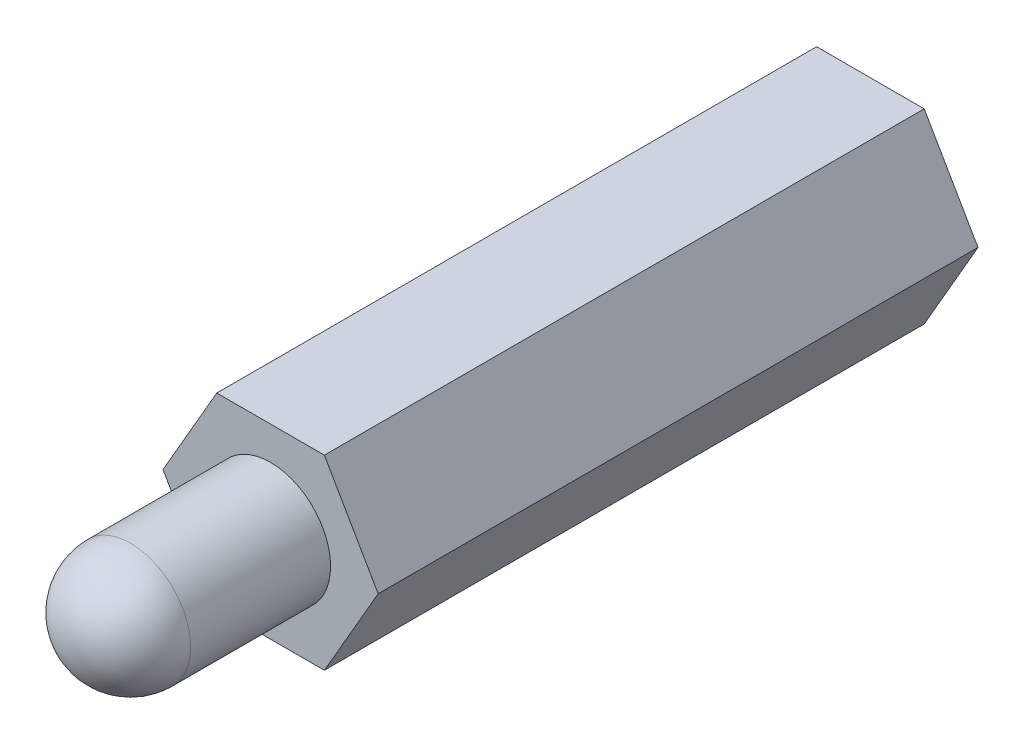
ISO-10303-21;
HEADER;
FILE_DESCRIPTION(('STEP AP214'),'2;1');
FILE_NAME('part.step','',(''),(''),'','','');
FILE_SCHEMA(('AUTOMOTIVE_DESIGN { 1 0 10303 214 1 1 1 1 }'));
ENDSEC;
DATA;
#1=APPLICATION_CONTEXT('core data for automotive mechanical design processes');
#2=APPLICATION_PROTOCOL_DEFINITION('international standard','automotive_design',2000,#1);
#3=PRODUCT_CONTEXT('',#1,'mechanical');
#4=PRODUCT('Part','Part','',(#3));
#5=PRODUCT_RELATED_PRODUCT_CATEGORY('part','',(#4));
#6=PRODUCT_DEFINITION_FORMATION('','',#4);
#7=PRODUCT_DEFINITION_CONTEXT('part definition',#1,'design');
#8=PRODUCT_DEFINITION('design','',#6,#7);
#9=PRODUCT_DEFINITION_SHAPE('','',#8);
#10=(LENGTH_UNIT() NAMED_UNIT(*) SI_UNIT(.MILLI.,.METRE.));
#11=(NAMED_UNIT(*) PLANE_ANGLE_UNIT() SI_UNIT($,.RADIAN.));
#12=(NAMED_UNIT(*) SI_UNIT($,.STERADIAN.) SOLID_ANGLE_UNIT());
#13=UNCERTAINTY_MEASURE_WITH_UNIT(LENGTH_MEASURE(1.E-05),#10,'distance_accuracy_value','');
#14=(GEOMETRIC_REPRESENTATION_CONTEXT(3) GLOBAL_UNCERTAINTY_ASSIGNED_CONTEXT((#13)) GLOBAL_UNIT_ASSIGNED_CONTEXT((#10,
#11,#12)) REPRESENTATION_CONTEXT('',''));
#15=CARTESIAN_POINT('',(0.,0.,0.));
#16=DIRECTION('',(0.,0.,1.));
#17=DIRECTION('',(1.,0.,0.));
#18=AXIS2_PLACEMENT_3D('',#15,#16,#17);
#19=CARTESIAN_POINT('',(0.,0.,15.));
#20=DIRECTION('',(0.,0.,1.));
#21=DIRECTION('',(1.,0.,0.));
#22=AXIS2_PLACEMENT_3D('',#19,#20,#21);
#23=PLANE('',#22);
#24=DIRECTION('',(0.499999999999995,0.866025403784442,0.));
#25=VECTOR('',#24,1.);
#26=CARTESIAN_POINT('',(1.34522612721185,-2.32999999999998,15.));
#27=LINE('',#26,#25);
#28=CARTESIAN_POINT('',(1.34522612721185,-2.32999999999998,15.));
#29=VERTEX_POINT('',#28);
#30=CARTESIAN_POINT('',(2.69045225442365,0.,15.));
#31=VERTEX_POINT('',#30);
#32=EDGE_CURVE('E131',#29,#31,#27,.T.);
#33=ORIENTED_EDGE('',*,*,#32,.T.);
#34=DIRECTION('',(-0.500000000000001,0.866025403784438,0.));
#35=VECTOR('',#34,1.);
#36=CARTESIAN_POINT('',(2.69045225442365,0.,15.));
#37=LINE('',#36,#35);
#38=CARTESIAN_POINT('',(1.34522612721182,2.33,15.));
#39=VERTEX_POINT('',#38);
#40=EDGE_CURVE('E89',#31,#39,#37,.T.);
#41=ORIENTED_EDGE('',*,*,#40,.T.);
#42=DIRECTION('',(-1.,0.,0.));
#43=VECTOR('',#42,1.);
#44=CARTESIAN_POINT('',(1.34522612721182,2.33,15.));
#45=LINE('',#44,#43);
#46=CARTESIAN_POINT('',(-1.34522612721183,2.32999999999999,15.));
#47=VERTEX_POINT('',#46);
#48=EDGE_CURVE('E102',#39,#47,#45,.T.);
#49=ORIENTED_EDGE('',*,*,#48,.T.);
#50=DIRECTION('',(-0.499999999999995,-0.866025403784441,0.));
#51=VECTOR('',#50,1.);
#52=CARTESIAN_POINT('',(-1.34522612721183,2.32999999999999,15.));
#53=LINE('',#52,#51);
#54=CARTESIAN_POINT('',(-2.69045225442365,0.,15.));
#55=VERTEX_POINT('',#54);
#56=EDGE_CURVE('E96',#47,#55,#53,.T.);
#57=ORIENTED_EDGE('',*,*,#56,.T.);
#58=DIRECTION('',(0.500000000000007,-0.866025403784435,0.));
#59=VECTOR('',#58,1.);
#60=CARTESIAN_POINT('',(-2.69045225442365,0.,15.));
#61=LINE('',#60,#59);
#62=CARTESIAN_POINT('',(-1.3452261272118,-2.33,15.));
#63=VERTEX_POINT('',#62);
#64=EDGE_CURVE('E100',#55,#63,#61,.T.);
#65=ORIENTED_EDGE('',*,*,#64,.T.);
#66=DIRECTION('',(1.,0.,0.));
#67=VECTOR('',#66,1.);
#68=CARTESIAN_POINT('',(-1.3452261272118,-2.33,15.));
#69=LINE('',#68,#67);
#70=EDGE_CURVE('E51',#63,#29,#69,.T.);
#71=ORIENTED_EDGE('',*,*,#70,.T.);
#72=EDGE_LOOP('',(#33,#41,#49,#57,#65,#71));
#73=FACE_BOUND('',#72,.T.);
#74=CARTESIAN_POINT('',(0.,0.,15.));
#75=DIRECTION('',(0.,0.,1.));
#76=DIRECTION('',(1.,0.,0.));
#77=AXIS2_PLACEMENT_3D('',#74,#75,#76);
#78=CIRCLE('',#77,1.5);
#79=CARTESIAN_POINT('',(1.5,0.,15.));
#80=VERTEX_POINT('',#79);
#81=EDGE_CURVE('E124',#80,#80,#78,.T.);
#82=ORIENTED_EDGE('',*,*,#81,.F.);
#83=EDGE_LOOP('',(#82));
#84=FACE_BOUND('',#83,.T.);
#85=ADVANCED_FACE('F34',(#73,#84),#23,.T.);
#86=CARTESIAN_POINT('',(1.34522612721185,-2.32999999999998,15.));
#87=DIRECTION('',(-0.866025403784441,0.499999999999995,0.));
#88=DIRECTION('',(-0.499999999999995,-0.866025403784442,0.));
#89=AXIS2_PLACEMENT_3D('',#86,#87,#88);
#90=PLANE('',#89);
#91=DIRECTION('',(0.499999999999995,0.866025403784442,0.));
#92=VECTOR('',#91,1.);
#93=CARTESIAN_POINT('',(1.34522612721185,-2.32999999999998,0.));
#94=LINE('',#93,#92);
#95=CARTESIAN_POINT('',(1.34522612721185,-2.32999999999998,0.));
#96=VERTEX_POINT('',#95);
#97=CARTESIAN_POINT('',(2.69045225442365,0.,0.));
#98=VERTEX_POINT('',#97);
#99=EDGE_CURVE('E120',#96,#98,#94,.T.);
#100=ORIENTED_EDGE('',*,*,#99,.T.);
#101=DIRECTION('',(0.,0.,-1.));
#102=VECTOR('',#101,1.);
#103=CARTESIAN_POINT('',(2.69045225442365,0.,15.));
#104=LINE('',#103,#102);
#105=EDGE_CURVE('E43',#31,#98,#104,.T.);
#106=ORIENTED_EDGE('',*,*,#105,.F.);
#107=ORIENTED_EDGE('',*,*,#32,.F.);
#108=DIRECTION('',(0.,0.,-1.));
#109=VECTOR('',#108,1.);
#110=CARTESIAN_POINT('',(1.34522612721185,-2.32999999999998,15.));
#111=LINE('',#110,#109);
#112=EDGE_CURVE('E116',#29,#96,#111,.T.);
#113=ORIENTED_EDGE('',*,*,#112,.T.);
#114=EDGE_LOOP('',(#100,#106,#107,#113));
#115=FACE_BOUND('',#114,.T.);
#116=ADVANCED_FACE('F142',(#115),#90,.F.);
#117=CARTESIAN_POINT('',(2.69045225442365,0.,15.));
#118=DIRECTION('',(-0.866025403784438,-0.500000000000001,0.));
#119=DIRECTION('',(0.500000000000001,-0.866025403784438,0.));
#120=AXIS2_PLACEMENT_3D('',#117,#118,#119);
#121=PLANE('',#120);
#122=DIRECTION('',(-0.500000000000001,0.866025403784438,0.));
#123=VECTOR('',#122,1.);
#124=CARTESIAN_POINT('',(2.69045225442365,0.,0.));
#125=LINE('',#124,#123);
#126=CARTESIAN_POINT('',(1.34522612721182,2.33,0.));
#127=VERTEX_POINT('',#126);
#128=EDGE_CURVE('E123',#98,#127,#125,.T.);
#129=ORIENTED_EDGE('',*,*,#128,.T.);
#130=DIRECTION('',(0.,0.,-1.));
#131=VECTOR('',#130,1.);
#132=CARTESIAN_POINT('',(1.34522612721182,2.33,15.));
#133=LINE('',#132,#131);
#134=EDGE_CURVE('E135',#39,#127,#133,.T.);
#135=ORIENTED_EDGE('',*,*,#134,.F.);
#136=ORIENTED_EDGE('',*,*,#40,.F.);
#137=ORIENTED_EDGE('',*,*,#105,.T.);
#138=EDGE_LOOP('',(#129,#135,#136,#137));
#139=FACE_BOUND('',#138,.T.);
#140=ADVANCED_FACE('F138',(#139),#121,.F.);
#141=CARTESIAN_POINT('',(1.34522612721182,2.33,15.));
#142=DIRECTION('',(0.,-1.,0.));
#143=DIRECTION('',(1.,0.,0.));
#144=AXIS2_PLACEMENT_3D('',#141,#142,#143);
#145=PLANE('',#144);
#146=DIRECTION('',(-1.,0.,0.));
#147=VECTOR('',#146,1.);
#148=CARTESIAN_POINT('',(1.34522612721182,2.33,0.));
#149=LINE('',#148,#147);
#150=CARTESIAN_POINT('',(-1.34522612721183,2.32999999999999,0.));
#151=VERTEX_POINT('',#150);
#152=EDGE_CURVE('E126',#127,#151,#149,.T.);
#153=ORIENTED_EDGE('',*,*,#152,.T.);
#154=DIRECTION('',(0.,0.,-1.));
#155=VECTOR('',#154,1.);
#156=CARTESIAN_POINT('',(-1.34522612721183,2.32999999999999,15.));
#157=LINE('',#156,#155);
#158=EDGE_CURVE('E111',#47,#151,#157,.T.);
#159=ORIENTED_EDGE('',*,*,#158,.F.);
#160=ORIENTED_EDGE('',*,*,#48,.F.);
#161=ORIENTED_EDGE('',*,*,#134,.T.);
#162=EDGE_LOOP('',(#153,#159,#160,#161));
#163=FACE_BOUND('',#162,.T.);
#164=ADVANCED_FACE('F147',(#163),#145,.F.);
#165=CARTESIAN_POINT('',(-1.34522612721183,2.32999999999999,15.));
#166=DIRECTION('',(0.866025403784441,-0.499999999999995,0.));
#167=DIRECTION('',(0.499999999999995,0.866025403784441,0.));
#168=AXIS2_PLACEMENT_3D('',#165,#166,#167);
#169=PLANE('',#168);
#170=DIRECTION('',(-0.499999999999995,-0.866025403784441,0.));
#171=VECTOR('',#170,1.);
#172=CARTESIAN_POINT('',(-1.34522612721183,2.32999999999999,0.));
#173=LINE('',#172,#171);
#174=CARTESIAN_POINT('',(-2.69045225442365,0.,0.));
#175=VERTEX_POINT('',#174);
#176=EDGE_CURVE('E110',#151,#175,#173,.T.);
#177=ORIENTED_EDGE('',*,*,#176,.T.);
#178=DIRECTION('',(0.,0.,-1.));
#179=VECTOR('',#178,1.);
#180=CARTESIAN_POINT('',(-2.69045225442365,0.,15.));
#181=LINE('',#180,#179);
#182=EDGE_CURVE('E107',#55,#175,#181,.T.);
#183=ORIENTED_EDGE('',*,*,#182,.F.);
#184=ORIENTED_EDGE('',*,*,#56,.F.);
#185=ORIENTED_EDGE('',*,*,#158,.T.);
#186=EDGE_LOOP('',(#177,#183,#184,#185));
#187=FACE_BOUND('',#186,.T.);
#188=ADVANCED_FACE('F108',(#187),#169,.F.);
#189=CARTESIAN_POINT('',(-2.69045225442365,0.,15.));
#190=DIRECTION('',(0.866025403784435,0.500000000000007,0.));
#191=DIRECTION('',(-0.500000000000007,0.866025403784435,0.));
#192=AXIS2_PLACEMENT_3D('',#189,#190,#191);
#193=PLANE('',#192);
#194=DIRECTION('',(0.500000000000007,-0.866025403784435,0.));
#195=VECTOR('',#194,1.);
#196=CARTESIAN_POINT('',(-2.69045225442365,0.,0.));
#197=LINE('',#196,#195);
#198=CARTESIAN_POINT('',(-1.3452261272118,-2.33,0.));
#199=VERTEX_POINT('',#198);
#200=EDGE_CURVE('E74',#175,#199,#197,.T.);
#201=ORIENTED_EDGE('',*,*,#200,.T.);
#202=DIRECTION('',(0.,0.,-1.));
#203=VECTOR('',#202,1.);
#204=CARTESIAN_POINT('',(-1.3452261272118,-2.33,15.));
#205=LINE('',#204,#203);
#206=EDGE_CURVE('E112',#63,#199,#205,.T.);
#207=ORIENTED_EDGE('',*,*,#206,.F.);
#208=ORIENTED_EDGE('',*,*,#64,.F.);
#209=ORIENTED_EDGE('',*,*,#182,.T.);
#210=EDGE_LOOP('',(#201,#207,#208,#209));
#211=FACE_BOUND('',#210,.T.);
#212=ADVANCED_FACE('F114',(#211),#193,.F.);
#213=CARTESIAN_POINT('',(-1.3452261272118,-2.33,15.));
#214=DIRECTION('',(0.,1.,0.));
#215=DIRECTION('',(-1.,0.,0.));
#216=AXIS2_PLACEMENT_3D('',#213,#214,#215);
#217=PLANE('',#216);
#218=DIRECTION('',(1.,0.,0.));
#219=VECTOR('',#218,1.);
#220=CARTESIAN_POINT('',(-1.3452261272118,-2.33,0.));
#221=LINE('',#220,#219);
#222=EDGE_CURVE('E80',#199,#96,#221,.T.);
#223=ORIENTED_EDGE('',*,*,#222,.T.);
#224=ORIENTED_EDGE('',*,*,#112,.F.);
#225=ORIENTED_EDGE('',*,*,#70,.F.);
#226=ORIENTED_EDGE('',*,*,#206,.T.);
#227=EDGE_LOOP('',(#223,#224,#225,#226));
#228=FACE_BOUND('',#227,.T.);
#229=ADVANCED_FACE('F170',(#228),#217,.F.);
#230=CARTESIAN_POINT('',(0.,0.,0.));
#231=DIRECTION('',(0.,0.,1.));
#232=DIRECTION('',(1.,0.,0.));
#233=AXIS2_PLACEMENT_3D('',#230,#231,#232);
#234=PLANE('',#233);
#235=CARTESIAN_POINT('',(0.,0.,0.));
#236=DIRECTION('',(0.,0.,-1.));
#237=DIRECTION('',(-1.,0.,0.));
#238=AXIS2_PLACEMENT_3D('',#235,#236,#237);
#239=CIRCLE('',#238,1.25);
#240=CARTESIAN_POINT('',(-1.25,0.,0.));
#241=VERTEX_POINT('',#240);
#242=EDGE_CURVE('E154',#241,#241,#239,.T.);
#243=ORIENTED_EDGE('',*,*,#242,.F.);
#244=EDGE_LOOP('',(#243));
#245=FACE_BOUND('',#244,.T.);
#246=ORIENTED_EDGE('',*,*,#99,.F.);
#247=ORIENTED_EDGE('',*,*,#222,.F.);
#248=ORIENTED_EDGE('',*,*,#200,.F.);
#249=ORIENTED_EDGE('',*,*,#176,.F.);
#250=ORIENTED_EDGE('',*,*,#152,.F.);
#251=ORIENTED_EDGE('',*,*,#128,.F.);
#252=EDGE_LOOP('',(#246,#247,#248,#249,#250,#251));
#253=FACE_BOUND('',#252,.T.);
#254=ADVANCED_FACE('F144',(#245,#253),#234,.F.);
#255=CARTESIAN_POINT('',(0.,0.,20.));
#256=DIRECTION('',(0.,0.,-1.));
#257=DIRECTION('',(-1.,0.,0.));
#258=AXIS2_PLACEMENT_3D('',#255,#256,#257);
#259=CYLINDRICAL_SURFACE('',#258,1.5);
#260=CARTESIAN_POINT('',(0.,0.,18.5));
#261=DIRECTION('',(0.,0.,-1.));
#262=DIRECTION('',(-1.,0.,0.));
#263=AXIS2_PLACEMENT_3D('',#260,#261,#262);
#264=CIRCLE('',#263,1.5);
#265=CARTESIAN_POINT('',(-1.5,0.,18.5));
#266=VERTEX_POINT('',#265);
#267=EDGE_CURVE('E11',#266,#266,#264,.T.);
#268=ORIENTED_EDGE('',*,*,#267,.T.);
#269=EDGE_LOOP('',(#268));
#270=FACE_BOUND('',#269,.T.);
#271=ORIENTED_EDGE('',*,*,#81,.T.);
#272=EDGE_LOOP('',(#271));
#273=FACE_BOUND('',#272,.T.);
#274=ADVANCED_FACE('F169',(#270,#273),#259,.T.);
#275=CARTESIAN_POINT('',(0.,0.,18.5));
#276=DIRECTION('',(0.,0.,1.));
#277=DIRECTION('',(1.,0.,0.));
#278=AXIS2_PLACEMENT_3D('',#275,#276,#277);
#279=SPHERICAL_SURFACE('',#278,1.5);
#280=ORIENTED_EDGE('',*,*,#267,.F.);
#281=EDGE_LOOP('',(#280));
#282=FACE_BOUND('',#281,.T.);
#283=ADVANCED_FACE('F36',(#282),#279,.T.);
#284=CARTESIAN_POINT('',(0.,0.,10.));
#285=DIRECTION('',(0.,0.,-1.));
#286=DIRECTION('',(-1.,0.,0.));
#287=AXIS2_PLACEMENT_3D('',#284,#285,#286);
#288=CYLINDRICAL_SURFACE('',#287,1.25);
#289=CARTESIAN_POINT('',(0.,0.,10.));
#290=DIRECTION('',(0.,0.,-1.));
#291=DIRECTION('',(-1.,0.,0.));
#292=AXIS2_PLACEMENT_3D('',#289,#290,#291);
#293=CIRCLE('',#292,1.25);
#294=CARTESIAN_POINT('',(-1.25,0.,10.));
#295=VERTEX_POINT('',#294);
#296=EDGE_CURVE('E153',#295,#295,#293,.T.);
#297=ORIENTED_EDGE('',*,*,#296,.F.);
#298=EDGE_LOOP('',(#297));
#299=FACE_BOUND('',#298,.T.);
#300=ORIENTED_EDGE('',*,*,#242,.T.);
#301=EDGE_LOOP('',(#300));
#302=FACE_BOUND('',#301,.T.);
#303=ADVANCED_FACE('F162',(#299,#302),#288,.F.);
#304=CARTESIAN_POINT('',(0.,0.,10.));
#305=DIRECTION('',(0.,0.,-1.));
#306=DIRECTION('',(-1.,0.,0.));
#307=AXIS2_PLACEMENT_3D('',#304,#305,#306);
#308=PLANE('',#307);
#309=ORIENTED_EDGE('',*,*,#296,.T.);
#310=EDGE_LOOP('',(#309));
#311=FACE_BOUND('',#310,.T.);
#312=ADVANCED_FACE('F160',(#311),#308,.T.);
#313=CLOSED_SHELL('',(#85,#116,#140,#164,#188,#212,#229,#254,#274,#283,#303,#312));
#314=MANIFOLD_SOLID_BREP('B2',#313);
#315=ADVANCED_BREP_SHAPE_REPRESENTATION('',(#18,#314),#14);
#316=SHAPE_DEFINITION_REPRESENTATION(#9,#315);
ENDSEC;
END-ISO-10303-21;
